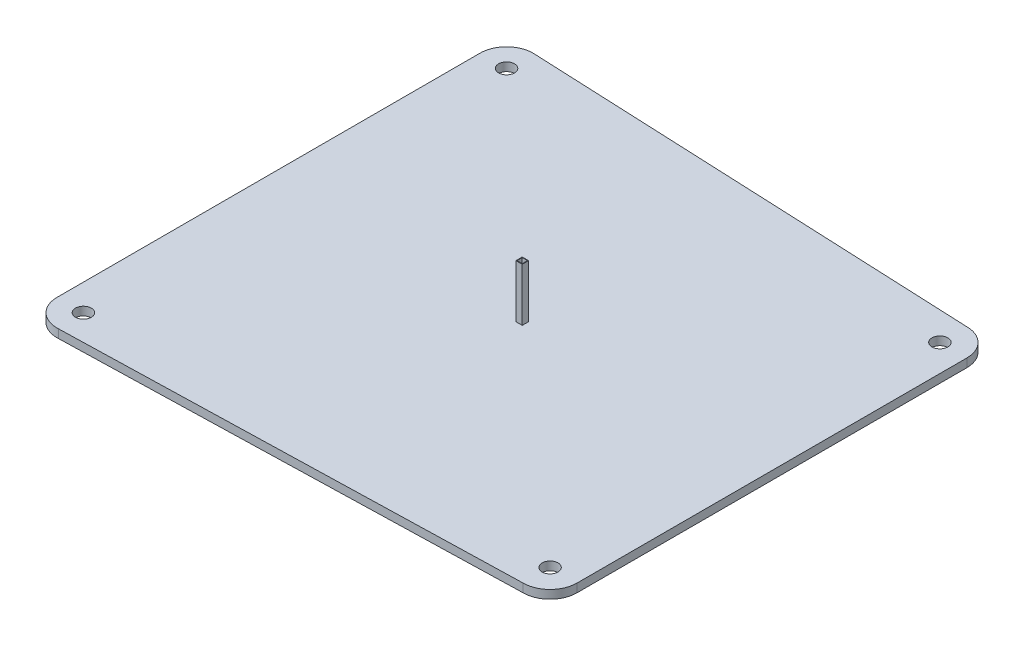
ISO-10303-21;
HEADER;
FILE_DESCRIPTION(('STEP AP214'),'2;1');
FILE_NAME('part.step','',(''),(''),'','','');
FILE_SCHEMA(('AUTOMOTIVE_DESIGN { 1 0 10303 214 1 1 1 1 }'));
ENDSEC;
DATA;
#1=APPLICATION_CONTEXT('core data for automotive mechanical design processes');
#2=APPLICATION_PROTOCOL_DEFINITION('international standard','automotive_design',2000,#1);
#3=PRODUCT_CONTEXT('',#1,'mechanical');
#4=PRODUCT('Part','Part','',(#3));
#5=PRODUCT_RELATED_PRODUCT_CATEGORY('part','',(#4));
#6=PRODUCT_DEFINITION_FORMATION('','',#4);
#7=PRODUCT_DEFINITION_CONTEXT('part definition',#1,'design');
#8=PRODUCT_DEFINITION('design','',#6,#7);
#9=PRODUCT_DEFINITION_SHAPE('','',#8);
#10=(LENGTH_UNIT() NAMED_UNIT(*) SI_UNIT(.MILLI.,.METRE.));
#11=(NAMED_UNIT(*) PLANE_ANGLE_UNIT() SI_UNIT($,.RADIAN.));
#12=(NAMED_UNIT(*) SI_UNIT($,.STERADIAN.) SOLID_ANGLE_UNIT());
#13=UNCERTAINTY_MEASURE_WITH_UNIT(LENGTH_MEASURE(1.E-05),#10,'distance_accuracy_value','');
#14=(GEOMETRIC_REPRESENTATION_CONTEXT(3) GLOBAL_UNCERTAINTY_ASSIGNED_CONTEXT((#13)) GLOBAL_UNIT_ASSIGNED_CONTEXT((#10,
#11,#12)) REPRESENTATION_CONTEXT('',''));
#15=CARTESIAN_POINT('',(0.,0.,0.));
#16=DIRECTION('',(0.,0.,1.));
#17=DIRECTION('',(1.,0.,0.));
#18=AXIS2_PLACEMENT_3D('',#15,#16,#17);
#19=CARTESIAN_POINT('',(0.,1.6,0.));
#20=DIRECTION('',(0.,-1.,0.));
#21=DIRECTION('',(0.,0.,-1.));
#22=AXIS2_PLACEMENT_3D('',#19,#20,#21);
#23=PLANE('',#22);
#24=CARTESIAN_POINT('',(-42.945,1.6,-39.985));
#25=DIRECTION('',(0.,1.,0.));
#26=DIRECTION('',(0.,0.,1.));
#27=AXIS2_PLACEMENT_3D('',#24,#25,#26);
#28=CIRCLE('',#27,1.5);
#29=CARTESIAN_POINT('',(-42.945,1.6,-38.485));
#30=VERTEX_POINT('',#29);
#31=EDGE_CURVE('E201',#30,#30,#28,.T.);
#32=ORIENTED_EDGE('',*,*,#31,.F.);
#33=EDGE_LOOP('',(#32));
#34=FACE_BOUND('',#33,.T.);
#35=CARTESIAN_POINT('',(-42.945,1.6,39.985));
#36=DIRECTION('',(0.,1.,0.));
#37=DIRECTION('',(0.,0.,1.));
#38=AXIS2_PLACEMENT_3D('',#35,#36,#37);
#39=CIRCLE('',#38,1.5);
#40=CARTESIAN_POINT('',(-42.945,1.6,41.485));
#41=VERTEX_POINT('',#40);
#42=EDGE_CURVE('E198',#41,#41,#39,.T.);
#43=ORIENTED_EDGE('',*,*,#42,.F.);
#44=EDGE_LOOP('',(#43));
#45=FACE_BOUND('',#44,.T.);
#46=CARTESIAN_POINT('',(42.845,1.6,37.585));
#47=DIRECTION('',(0.,1.,0.));
#48=DIRECTION('',(0.,0.,1.));
#49=AXIS2_PLACEMENT_3D('',#46,#47,#48);
#50=CIRCLE('',#49,1.5);
#51=CARTESIAN_POINT('',(42.845,1.6,39.085));
#52=VERTEX_POINT('',#51);
#53=EDGE_CURVE('E194',#52,#52,#50,.T.);
#54=ORIENTED_EDGE('',*,*,#53,.F.);
#55=EDGE_LOOP('',(#54));
#56=FACE_BOUND('',#55,.T.);
#57=CARTESIAN_POINT('',(42.845,1.6,-36.085));
#58=DIRECTION('',(0.,1.,0.));
#59=DIRECTION('',(0.,0.,1.));
#60=AXIS2_PLACEMENT_3D('',#57,#58,#59);
#61=CIRCLE('',#60,1.5);
#62=CARTESIAN_POINT('',(42.845,1.6,-34.585));
#63=VERTEX_POINT('',#62);
#64=EDGE_CURVE('E190',#63,#63,#61,.T.);
#65=ORIENTED_EDGE('',*,*,#64,.F.);
#66=EDGE_LOOP('',(#65));
#67=FACE_BOUND('',#66,.T.);
#68=DIRECTION('',(0.,0.,-1.));
#69=VECTOR('',#68,1.);
#70=CARTESIAN_POINT('',(0.600000000000001,1.6,0.6));
#71=LINE('',#70,#69);
#72=CARTESIAN_POINT('',(0.600000000000001,1.6,0.6));
#73=VERTEX_POINT('',#72);
#74=CARTESIAN_POINT('',(0.600000000000001,1.6,-0.6));
#75=VERTEX_POINT('',#74);
#76=EDGE_CURVE('E265',#73,#75,#71,.T.);
#77=ORIENTED_EDGE('',*,*,#76,.F.);
#78=DIRECTION('',(1.,0.,0.));
#79=VECTOR('',#78,1.);
#80=CARTESIAN_POINT('',(-0.599999999999999,1.6,0.6));
#81=LINE('',#80,#79);
#82=CARTESIAN_POINT('',(-0.599999999999999,1.6,0.6));
#83=VERTEX_POINT('',#82);
#84=EDGE_CURVE('E270',#83,#73,#81,.T.);
#85=ORIENTED_EDGE('',*,*,#84,.F.);
#86=DIRECTION('',(0.,0.,1.));
#87=VECTOR('',#86,1.);
#88=CARTESIAN_POINT('',(-0.599999999999999,1.6,0.6));
#89=LINE('',#88,#87);
#90=CARTESIAN_POINT('',(-0.599999999999999,1.6,-0.6));
#91=VERTEX_POINT('',#90);
#92=EDGE_CURVE('E282',#91,#83,#89,.T.);
#93=ORIENTED_EDGE('',*,*,#92,.F.);
#94=DIRECTION('',(-1.,0.,0.));
#95=VECTOR('',#94,1.);
#96=CARTESIAN_POINT('',(-0.599999999999999,1.6,-0.6));
#97=LINE('',#96,#95);
#98=EDGE_CURVE('E279',#75,#91,#97,.T.);
#99=ORIENTED_EDGE('',*,*,#98,.F.);
#100=EDGE_LOOP('',(#77,#85,#93,#99));
#101=FACE_BOUND('',#100,.T.);
#102=CARTESIAN_POINT('',(-42.945,1.6,-39.985));
#103=DIRECTION('',(0.,1.,0.));
#104=DIRECTION('',(0.,0.,1.));
#105=AXIS2_PLACEMENT_3D('',#102,#103,#104);
#106=CIRCLE('',#105,5.00000000000002);
#107=CARTESIAN_POINT('',(-42.5029252724991,1.6,-44.9654186506061));
#108=VERTEX_POINT('',#107);
#109=CARTESIAN_POINT('',(-47.945,1.6,-39.985));
#110=VERTEX_POINT('',#109);
#111=EDGE_CURVE('E159',#108,#110,#106,.T.);
#112=ORIENTED_EDGE('',*,*,#111,.T.);
#113=DIRECTION('',(0.,0.,1.));
#114=VECTOR('',#113,1.);
#115=CARTESIAN_POINT('',(-47.945,1.6,45.085));
#116=LINE('',#115,#114);
#117=CARTESIAN_POINT('',(-47.945,1.6,39.985));
#118=VERTEX_POINT('',#117);
#119=EDGE_CURVE('E166',#110,#118,#116,.T.);
#120=ORIENTED_EDGE('',*,*,#119,.T.);
#121=CARTESIAN_POINT('',(-42.945,1.6,39.985));
#122=DIRECTION('',(0.,1.,0.));
#123=DIRECTION('',(0.,0.,1.));
#124=AXIS2_PLACEMENT_3D('',#121,#122,#123);
#125=CIRCLE('',#124,5.);
#126=CARTESIAN_POINT('',(-42.6770960432094,1.6,44.9778175882898));
#127=VERTEX_POINT('',#126);
#128=EDGE_CURVE('E150',#118,#127,#125,.T.);
#129=ORIENTED_EDGE('',*,*,#128,.T.);
#130=DIRECTION('',(0.999640814907525,0.,-0.0268000218473834));
#131=VECTOR('',#130,1.);
#132=CARTESIAN_POINT('',(-42.6770960432094,1.6,44.9778175882898));
#133=LINE('',#132,#131);
#134=CARTESIAN_POINT('',(42.845,1.6,42.6850000000003));
#135=VERTEX_POINT('',#134);
#136=EDGE_CURVE('E158',#127,#135,#133,.T.);
#137=ORIENTED_EDGE('',*,*,#136,.T.);
#138=CARTESIAN_POINT('',(42.845,1.6,37.585));
#139=DIRECTION('',(0.,1.,0.));
#140=DIRECTION('',(0.,0.,1.));
#141=AXIS2_PLACEMENT_3D('',#138,#139,#140);
#142=CIRCLE('',#141,5.10000000000028);
#143=CARTESIAN_POINT('',(47.9450000000003,1.6,37.585));
#144=VERTEX_POINT('',#143);
#145=EDGE_CURVE('E375',#135,#144,#142,.T.);
#146=ORIENTED_EDGE('',*,*,#145,.T.);
#147=DIRECTION('',(0.,0.,-1.));
#148=VECTOR('',#147,1.);
#149=CARTESIAN_POINT('',(47.945,1.6,45.085));
#150=LINE('',#149,#148);
#151=CARTESIAN_POINT('',(47.9450000000002,1.6,-36.085));
#152=VERTEX_POINT('',#151);
#153=EDGE_CURVE('E175',#144,#152,#150,.T.);
#154=ORIENTED_EDGE('',*,*,#153,.T.);
#155=CARTESIAN_POINT('',(42.845,1.6,-36.085));
#156=DIRECTION('',(0.,1.,0.));
#157=DIRECTION('',(0.,0.,1.));
#158=AXIS2_PLACEMENT_3D('',#155,#156,#157);
#159=CIRCLE('',#158,5.10000000000022);
#160=CARTESIAN_POINT('',(42.845,1.6,-41.1850000000002));
#161=VERTEX_POINT('',#160);
#162=EDGE_CURVE('E379',#152,#161,#159,.T.);
#163=ORIENTED_EDGE('',*,*,#162,.T.);
#164=DIRECTION('',(-0.999020452773921,0.,-0.0442508185166185));
#165=VECTOR('',#164,1.);
#166=CARTESIAN_POINT('',(-42.5029252724991,1.6,-44.9654186506061));
#167=LINE('',#166,#165);
#168=EDGE_CURVE('E229',#161,#108,#167,.T.);
#169=ORIENTED_EDGE('',*,*,#168,.T.);
#170=EDGE_LOOP('',(#112,#120,#129,#137,#146,#154,#163,#169));
#171=FACE_BOUND('',#170,.T.);
#172=ADVANCED_FACE('F39',(#34,#45,#56,#67,#101,#171),#23,.F.);
#173=CARTESIAN_POINT('',(47.945,1.6,45.085));
#174=DIRECTION('',(-1.,0.,0.));
#175=DIRECTION('',(0.,0.,1.));
#176=AXIS2_PLACEMENT_3D('',#173,#174,#175);
#177=PLANE('',#176);
#178=DIRECTION('',(0.,0.,-1.));
#179=VECTOR('',#178,1.);
#180=CARTESIAN_POINT('',(47.945,0.,45.085));
#181=LINE('',#180,#179);
#182=CARTESIAN_POINT('',(47.9450000000003,0.,37.585));
#183=VERTEX_POINT('',#182);
#184=CARTESIAN_POINT('',(47.945,0.,-36.085));
#185=VERTEX_POINT('',#184);
#186=EDGE_CURVE('E183',#183,#185,#181,.T.);
#187=ORIENTED_EDGE('',*,*,#186,.T.);
#188=DIRECTION('',(0.,1.,0.));
#189=VECTOR('',#188,1.);
#190=CARTESIAN_POINT('',(47.9450000000002,-8.4,-36.085));
#191=LINE('',#190,#189);
#192=EDGE_CURVE('E62',#185,#152,#191,.T.);
#193=ORIENTED_EDGE('',*,*,#192,.T.);
#194=ORIENTED_EDGE('',*,*,#153,.F.);
#195=DIRECTION('',(0.,1.,0.));
#196=VECTOR('',#195,1.);
#197=CARTESIAN_POINT('',(47.9450000000003,-8.4,37.585));
#198=LINE('',#197,#196);
#199=EDGE_CURVE('E233',#183,#144,#198,.T.);
#200=ORIENTED_EDGE('',*,*,#199,.F.);
#201=EDGE_LOOP('',(#187,#193,#194,#200));
#202=FACE_BOUND('',#201,.T.);
#203=ADVANCED_FACE('F41',(#202),#177,.F.);
#204=CARTESIAN_POINT('',(-47.945,1.6,45.085));
#205=DIRECTION('',(1.,0.,0.));
#206=DIRECTION('',(0.,0.,-1.));
#207=AXIS2_PLACEMENT_3D('',#204,#205,#206);
#208=PLANE('',#207);
#209=DIRECTION('',(0.,1.,0.));
#210=VECTOR('',#209,1.);
#211=CARTESIAN_POINT('',(-47.945,-8.4,-39.985));
#212=LINE('',#211,#210);
#213=CARTESIAN_POINT('',(-47.945,0.,-39.985));
#214=VERTEX_POINT('',#213);
#215=EDGE_CURVE('E169',#214,#110,#212,.T.);
#216=ORIENTED_EDGE('',*,*,#215,.F.);
#217=DIRECTION('',(0.,0.,1.));
#218=VECTOR('',#217,1.);
#219=CARTESIAN_POINT('',(-47.945,0.,45.085));
#220=LINE('',#219,#218);
#221=CARTESIAN_POINT('',(-47.945,0.,39.985));
#222=VERTEX_POINT('',#221);
#223=EDGE_CURVE('E168',#214,#222,#220,.T.);
#224=ORIENTED_EDGE('',*,*,#223,.T.);
#225=DIRECTION('',(0.,1.,0.));
#226=VECTOR('',#225,1.);
#227=CARTESIAN_POINT('',(-47.945,-8.4,39.985));
#228=LINE('',#227,#226);
#229=EDGE_CURVE('E54',#222,#118,#228,.T.);
#230=ORIENTED_EDGE('',*,*,#229,.T.);
#231=ORIENTED_EDGE('',*,*,#119,.F.);
#232=EDGE_LOOP('',(#216,#224,#230,#231));
#233=FACE_BOUND('',#232,.T.);
#234=ADVANCED_FACE('F165',(#233),#208,.F.);
#235=CARTESIAN_POINT('',(0.,0.,0.));
#236=DIRECTION('',(0.,-1.,0.));
#237=DIRECTION('',(0.,0.,-1.));
#238=AXIS2_PLACEMENT_3D('',#235,#236,#237);
#239=PLANE('',#238);
#240=CARTESIAN_POINT('',(-42.945,0.,-39.985));
#241=DIRECTION('',(0.,-1.,0.));
#242=DIRECTION('',(0.,0.,-1.));
#243=AXIS2_PLACEMENT_3D('',#240,#241,#242);
#244=CIRCLE('',#243,1.5);
#245=CARTESIAN_POINT('',(-42.945,0.,-41.485));
#246=VERTEX_POINT('',#245);
#247=EDGE_CURVE('E199',#246,#246,#244,.T.);
#248=ORIENTED_EDGE('',*,*,#247,.F.);
#249=EDGE_LOOP('',(#248));
#250=FACE_BOUND('',#249,.T.);
#251=CARTESIAN_POINT('',(-42.945,0.,39.985));
#252=DIRECTION('',(0.,-1.,0.));
#253=DIRECTION('',(0.,0.,-1.));
#254=AXIS2_PLACEMENT_3D('',#251,#252,#253);
#255=CIRCLE('',#254,1.5);
#256=CARTESIAN_POINT('',(-42.945,0.,38.485));
#257=VERTEX_POINT('',#256);
#258=EDGE_CURVE('E195',#257,#257,#255,.T.);
#259=ORIENTED_EDGE('',*,*,#258,.F.);
#260=EDGE_LOOP('',(#259));
#261=FACE_BOUND('',#260,.T.);
#262=CARTESIAN_POINT('',(42.845,0.,37.585));
#263=DIRECTION('',(0.,-1.,0.));
#264=DIRECTION('',(0.,0.,-1.));
#265=AXIS2_PLACEMENT_3D('',#262,#263,#264);
#266=CIRCLE('',#265,1.5);
#267=CARTESIAN_POINT('',(42.845,0.,36.085));
#268=VERTEX_POINT('',#267);
#269=EDGE_CURVE('E191',#268,#268,#266,.T.);
#270=ORIENTED_EDGE('',*,*,#269,.F.);
#271=EDGE_LOOP('',(#270));
#272=FACE_BOUND('',#271,.T.);
#273=CARTESIAN_POINT('',(42.845,0.,-36.085));
#274=DIRECTION('',(0.,-1.,0.));
#275=DIRECTION('',(0.,0.,-1.));
#276=AXIS2_PLACEMENT_3D('',#273,#274,#275);
#277=CIRCLE('',#276,1.5);
#278=CARTESIAN_POINT('',(42.845,0.,-37.585));
#279=VERTEX_POINT('',#278);
#280=EDGE_CURVE('E186',#279,#279,#277,.T.);
#281=ORIENTED_EDGE('',*,*,#280,.F.);
#282=EDGE_LOOP('',(#281));
#283=FACE_BOUND('',#282,.T.);
#284=ORIENTED_EDGE('',*,*,#223,.F.);
#285=CARTESIAN_POINT('',(-42.945,0.,-39.985));
#286=DIRECTION('',(0.,-1.,0.));
#287=DIRECTION('',(0.,0.,-1.));
#288=AXIS2_PLACEMENT_3D('',#285,#286,#287);
#289=CIRCLE('',#288,5.00000000000002);
#290=CARTESIAN_POINT('',(-42.5029252724991,0.,-44.9654186506061));
#291=VERTEX_POINT('',#290);
#292=EDGE_CURVE('E12',#214,#291,#289,.T.);
#293=ORIENTED_EDGE('',*,*,#292,.T.);
#294=DIRECTION('',(0.999020452773921,0.,0.0442508185166185));
#295=VECTOR('',#294,1.);
#296=CARTESIAN_POINT('',(1.90458105669061,0.,-42.998423382499));
#297=LINE('',#296,#295);
#298=CARTESIAN_POINT('',(42.845,0.,-41.1850000000002));
#299=VERTEX_POINT('',#298);
#300=EDGE_CURVE('E47',#291,#299,#297,.T.);
#301=ORIENTED_EDGE('',*,*,#300,.T.);
#302=CARTESIAN_POINT('',(42.845,0.,-36.085));
#303=DIRECTION('',(0.,-1.,0.));
#304=DIRECTION('',(0.,0.,-1.));
#305=AXIS2_PLACEMENT_3D('',#302,#303,#304);
#306=CIRCLE('',#305,5.10000000000022);
#307=EDGE_CURVE('E208',#299,#185,#306,.T.);
#308=ORIENTED_EDGE('',*,*,#307,.T.);
#309=ORIENTED_EDGE('',*,*,#186,.F.);
#310=CARTESIAN_POINT('',(42.845,0.,37.585));
#311=DIRECTION('',(0.,-1.,0.));
#312=DIRECTION('',(0.,0.,-1.));
#313=AXIS2_PLACEMENT_3D('',#310,#311,#312);
#314=CIRCLE('',#313,5.10000000000028);
#315=CARTESIAN_POINT('',(42.845,0.,42.6850000000003));
#316=VERTEX_POINT('',#315);
#317=EDGE_CURVE('E205',#183,#316,#314,.T.);
#318=ORIENTED_EDGE('',*,*,#317,.T.);
#319=DIRECTION('',(-0.999640814907525,0.,0.0268000218473834));
#320=VECTOR('',#319,1.);
#321=CARTESIAN_POINT('',(1.17432108253295,0.,43.8021763784845));
#322=LINE('',#321,#320);
#323=CARTESIAN_POINT('',(-42.6770960432094,0.,44.9778175882898));
#324=VERTEX_POINT('',#323);
#325=EDGE_CURVE('E177',#316,#324,#322,.T.);
#326=ORIENTED_EDGE('',*,*,#325,.T.);
#327=CARTESIAN_POINT('',(-42.945,0.,39.985));
#328=DIRECTION('',(0.,-1.,0.));
#329=DIRECTION('',(0.,0.,-1.));
#330=AXIS2_PLACEMENT_3D('',#327,#328,#329);
#331=CIRCLE('',#330,5.);
#332=EDGE_CURVE('E174',#324,#222,#331,.T.);
#333=ORIENTED_EDGE('',*,*,#332,.T.);
#334=EDGE_LOOP('',(#284,#293,#301,#308,#309,#318,#326,#333));
#335=FACE_BOUND('',#334,.T.);
#336=ADVANCED_FACE('F211',(#250,#261,#272,#283,#335),#239,.T.);
#337=CARTESIAN_POINT('',(42.845,-8.4,-36.085));
#338=DIRECTION('',(0.,1.,0.));
#339=DIRECTION('',(0.,0.,1.));
#340=AXIS2_PLACEMENT_3D('',#337,#338,#339);
#341=CYLINDRICAL_SURFACE('',#340,1.5);
#342=ORIENTED_EDGE('',*,*,#280,.T.);
#343=EDGE_LOOP('',(#342));
#344=FACE_BOUND('',#343,.T.);
#345=ORIENTED_EDGE('',*,*,#64,.T.);
#346=EDGE_LOOP('',(#345));
#347=FACE_BOUND('',#346,.T.);
#348=ADVANCED_FACE('F306',(#344,#347),#341,.F.);
#349=CARTESIAN_POINT('',(42.845,-8.4,37.585));
#350=DIRECTION('',(0.,1.,0.));
#351=DIRECTION('',(0.,0.,1.));
#352=AXIS2_PLACEMENT_3D('',#349,#350,#351);
#353=CYLINDRICAL_SURFACE('',#352,1.5);
#354=ORIENTED_EDGE('',*,*,#269,.T.);
#355=EDGE_LOOP('',(#354));
#356=FACE_BOUND('',#355,.T.);
#357=ORIENTED_EDGE('',*,*,#53,.T.);
#358=EDGE_LOOP('',(#357));
#359=FACE_BOUND('',#358,.T.);
#360=ADVANCED_FACE('F348',(#356,#359),#353,.F.);
#361=CARTESIAN_POINT('',(-42.945,-8.4,39.985));
#362=DIRECTION('',(0.,1.,0.));
#363=DIRECTION('',(0.,0.,1.));
#364=AXIS2_PLACEMENT_3D('',#361,#362,#363);
#365=CYLINDRICAL_SURFACE('',#364,1.5);
#366=ORIENTED_EDGE('',*,*,#258,.T.);
#367=EDGE_LOOP('',(#366));
#368=FACE_BOUND('',#367,.T.);
#369=ORIENTED_EDGE('',*,*,#42,.T.);
#370=EDGE_LOOP('',(#369));
#371=FACE_BOUND('',#370,.T.);
#372=ADVANCED_FACE('F344',(#368,#371),#365,.F.);
#373=CARTESIAN_POINT('',(-42.945,-8.4,-39.985));
#374=DIRECTION('',(0.,1.,0.));
#375=DIRECTION('',(0.,0.,1.));
#376=AXIS2_PLACEMENT_3D('',#373,#374,#375);
#377=CYLINDRICAL_SURFACE('',#376,1.5);
#378=ORIENTED_EDGE('',*,*,#247,.T.);
#379=EDGE_LOOP('',(#378));
#380=FACE_BOUND('',#379,.T.);
#381=ORIENTED_EDGE('',*,*,#31,.T.);
#382=EDGE_LOOP('',(#381));
#383=FACE_BOUND('',#382,.T.);
#384=ADVANCED_FACE('F341',(#380,#383),#377,.F.);
#385=CARTESIAN_POINT('',(0.,11.6,0.));
#386=DIRECTION('',(0.,-1.,0.));
#387=DIRECTION('',(0.,0.,-1.));
#388=AXIS2_PLACEMENT_3D('',#385,#386,#387);
#389=PLANE('',#388);
#390=DIRECTION('',(0.,0.,-1.));
#391=VECTOR('',#390,1.);
#392=CARTESIAN_POINT('',(0.600000000000001,11.6,0.6));
#393=LINE('',#392,#391);
#394=CARTESIAN_POINT('',(0.600000000000001,11.6,0.6));
#395=VERTEX_POINT('',#394);
#396=CARTESIAN_POINT('',(0.600000000000001,11.6,-0.6));
#397=VERTEX_POINT('',#396);
#398=EDGE_CURVE('E266',#395,#397,#393,.T.);
#399=ORIENTED_EDGE('',*,*,#398,.T.);
#400=DIRECTION('',(-1.,0.,0.));
#401=VECTOR('',#400,1.);
#402=CARTESIAN_POINT('',(-0.599999999999999,11.6,-0.6));
#403=LINE('',#402,#401);
#404=CARTESIAN_POINT('',(-0.599999999999999,11.6,-0.6));
#405=VERTEX_POINT('',#404);
#406=EDGE_CURVE('E269',#397,#405,#403,.T.);
#407=ORIENTED_EDGE('',*,*,#406,.T.);
#408=DIRECTION('',(0.,0.,1.));
#409=VECTOR('',#408,1.);
#410=CARTESIAN_POINT('',(-0.599999999999999,11.6,0.6));
#411=LINE('',#410,#409);
#412=CARTESIAN_POINT('',(-0.599999999999999,11.6,0.6));
#413=VERTEX_POINT('',#412);
#414=EDGE_CURVE('E272',#405,#413,#411,.T.);
#415=ORIENTED_EDGE('',*,*,#414,.T.);
#416=DIRECTION('',(1.,0.,0.));
#417=VECTOR('',#416,1.);
#418=CARTESIAN_POINT('',(-0.599999999999999,11.6,0.6));
#419=LINE('',#418,#417);
#420=EDGE_CURVE('E274',#413,#395,#419,.T.);
#421=ORIENTED_EDGE('',*,*,#420,.T.);
#422=EDGE_LOOP('',(#399,#407,#415,#421));
#423=FACE_BOUND('',#422,.T.);
#424=DIRECTION('',(0.,0.,-1.));
#425=VECTOR('',#424,1.);
#426=CARTESIAN_POINT('',(0.5,11.6,0.5));
#427=LINE('',#426,#425);
#428=CARTESIAN_POINT('',(0.5,11.6,0.5));
#429=VERTEX_POINT('',#428);
#430=CARTESIAN_POINT('',(0.5,11.6,-0.5));
#431=VERTEX_POINT('',#430);
#432=EDGE_CURVE('E239',#429,#431,#427,.T.);
#433=ORIENTED_EDGE('',*,*,#432,.F.);
#434=DIRECTION('',(1.,0.,0.));
#435=VECTOR('',#434,1.);
#436=CARTESIAN_POINT('',(-0.5,11.6,0.5));
#437=LINE('',#436,#435);
#438=CARTESIAN_POINT('',(-0.5,11.6,0.5));
#439=VERTEX_POINT('',#438);
#440=EDGE_CURVE('E247',#439,#429,#437,.T.);
#441=ORIENTED_EDGE('',*,*,#440,.F.);
#442=DIRECTION('',(0.,0.,1.));
#443=VECTOR('',#442,1.);
#444=CARTESIAN_POINT('',(-0.5,11.6,0.5));
#445=LINE('',#444,#443);
#446=CARTESIAN_POINT('',(-0.5,11.6,-0.5));
#447=VERTEX_POINT('',#446);
#448=EDGE_CURVE('E244',#447,#439,#445,.T.);
#449=ORIENTED_EDGE('',*,*,#448,.F.);
#450=DIRECTION('',(-1.,0.,0.));
#451=VECTOR('',#450,1.);
#452=CARTESIAN_POINT('',(-0.5,11.6,-0.5));
#453=LINE('',#452,#451);
#454=EDGE_CURVE('E241',#431,#447,#453,.T.);
#455=ORIENTED_EDGE('',*,*,#454,.F.);
#456=EDGE_LOOP('',(#433,#441,#449,#455));
#457=FACE_BOUND('',#456,.T.);
#458=ADVANCED_FACE('F323',(#423,#457),#389,.F.);
#459=CARTESIAN_POINT('',(0.600000000000001,11.6,0.6));
#460=DIRECTION('',(-1.,0.,0.));
#461=DIRECTION('',(0.,0.,1.));
#462=AXIS2_PLACEMENT_3D('',#459,#460,#461);
#463=PLANE('',#462);
#464=ORIENTED_EDGE('',*,*,#76,.T.);
#465=DIRECTION('',(0.,-1.,0.));
#466=VECTOR('',#465,1.);
#467=CARTESIAN_POINT('',(0.600000000000001,11.6,-0.6));
#468=LINE('',#467,#466);
#469=EDGE_CURVE('E295',#397,#75,#468,.T.);
#470=ORIENTED_EDGE('',*,*,#469,.F.);
#471=ORIENTED_EDGE('',*,*,#398,.F.);
#472=DIRECTION('',(0.,-1.,0.));
#473=VECTOR('',#472,1.);
#474=CARTESIAN_POINT('',(0.600000000000001,11.6,0.6));
#475=LINE('',#474,#473);
#476=EDGE_CURVE('E276',#395,#73,#475,.T.);
#477=ORIENTED_EDGE('',*,*,#476,.T.);
#478=EDGE_LOOP('',(#464,#470,#471,#477));
#479=FACE_BOUND('',#478,.T.);
#480=ADVANCED_FACE('F321',(#479),#463,.F.);
#481=CARTESIAN_POINT('',(-0.599999999999999,11.6,-0.6));
#482=DIRECTION('',(0.,0.,1.));
#483=DIRECTION('',(1.,0.,0.));
#484=AXIS2_PLACEMENT_3D('',#481,#482,#483);
#485=PLANE('',#484);
#486=ORIENTED_EDGE('',*,*,#98,.T.);
#487=DIRECTION('',(0.,-1.,0.));
#488=VECTOR('',#487,1.);
#489=CARTESIAN_POINT('',(-0.599999999999999,11.6,-0.6));
#490=LINE('',#489,#488);
#491=EDGE_CURVE('E292',#405,#91,#490,.T.);
#492=ORIENTED_EDGE('',*,*,#491,.F.);
#493=ORIENTED_EDGE('',*,*,#406,.F.);
#494=ORIENTED_EDGE('',*,*,#469,.T.);
#495=EDGE_LOOP('',(#486,#492,#493,#494));
#496=FACE_BOUND('',#495,.T.);
#497=ADVANCED_FACE('F330',(#496),#485,.F.);
#498=CARTESIAN_POINT('',(-0.599999999999999,11.6,0.6));
#499=DIRECTION('',(1.,0.,0.));
#500=DIRECTION('',(0.,0.,-1.));
#501=AXIS2_PLACEMENT_3D('',#498,#499,#500);
#502=PLANE('',#501);
#503=ORIENTED_EDGE('',*,*,#92,.T.);
#504=DIRECTION('',(0.,-1.,0.));
#505=VECTOR('',#504,1.);
#506=CARTESIAN_POINT('',(-0.599999999999999,11.6,0.6));
#507=LINE('',#506,#505);
#508=EDGE_CURVE('E289',#413,#83,#507,.T.);
#509=ORIENTED_EDGE('',*,*,#508,.F.);
#510=ORIENTED_EDGE('',*,*,#414,.F.);
#511=ORIENTED_EDGE('',*,*,#491,.T.);
#512=EDGE_LOOP('',(#503,#509,#510,#511));
#513=FACE_BOUND('',#512,.T.);
#514=ADVANCED_FACE('F328',(#513),#502,.F.);
#515=CARTESIAN_POINT('',(-0.599999999999999,11.6,0.6));
#516=DIRECTION('',(0.,0.,-1.));
#517=DIRECTION('',(-1.,0.,0.));
#518=AXIS2_PLACEMENT_3D('',#515,#516,#517);
#519=PLANE('',#518);
#520=ORIENTED_EDGE('',*,*,#84,.T.);
#521=ORIENTED_EDGE('',*,*,#476,.F.);
#522=ORIENTED_EDGE('',*,*,#420,.F.);
#523=ORIENTED_EDGE('',*,*,#508,.T.);
#524=EDGE_LOOP('',(#520,#521,#522,#523));
#525=FACE_BOUND('',#524,.T.);
#526=ADVANCED_FACE('F317',(#525),#519,.F.);
#527=CARTESIAN_POINT('',(0.5,11.6,0.5));
#528=DIRECTION('',(-1.,0.,0.));
#529=DIRECTION('',(0.,0.,1.));
#530=AXIS2_PLACEMENT_3D('',#527,#528,#529);
#531=PLANE('',#530);
#532=DIRECTION('',(0.,0.,-1.));
#533=VECTOR('',#532,1.);
#534=CARTESIAN_POINT('',(0.5,1.6,0.5));
#535=LINE('',#534,#533);
#536=CARTESIAN_POINT('',(0.5,1.6,0.5));
#537=VERTEX_POINT('',#536);
#538=CARTESIAN_POINT('',(0.5,1.6,-0.5));
#539=VERTEX_POINT('',#538);
#540=EDGE_CURVE('E222',#537,#539,#535,.T.);
#541=ORIENTED_EDGE('',*,*,#540,.F.);
#542=DIRECTION('',(0.,-1.,0.));
#543=VECTOR('',#542,1.);
#544=CARTESIAN_POINT('',(0.5,11.6,0.5));
#545=LINE('',#544,#543);
#546=EDGE_CURVE('E248',#429,#537,#545,.T.);
#547=ORIENTED_EDGE('',*,*,#546,.F.);
#548=ORIENTED_EDGE('',*,*,#432,.T.);
#549=DIRECTION('',(0.,-1.,0.));
#550=VECTOR('',#549,1.);
#551=CARTESIAN_POINT('',(0.5,11.6,-0.5));
#552=LINE('',#551,#550);
#553=EDGE_CURVE('E262',#431,#539,#552,.T.);
#554=ORIENTED_EDGE('',*,*,#553,.T.);
#555=EDGE_LOOP('',(#541,#547,#548,#554));
#556=FACE_BOUND('',#555,.T.);
#557=ADVANCED_FACE('F409',(#556),#531,.T.);
#558=CARTESIAN_POINT('',(-0.5,11.6,-0.5));
#559=DIRECTION('',(0.,0.,1.));
#560=DIRECTION('',(1.,0.,0.));
#561=AXIS2_PLACEMENT_3D('',#558,#559,#560);
#562=PLANE('',#561);
#563=DIRECTION('',(-1.,0.,0.));
#564=VECTOR('',#563,1.);
#565=CARTESIAN_POINT('',(-0.5,1.6,-0.5));
#566=LINE('',#565,#564);
#567=CARTESIAN_POINT('',(-0.5,1.6,-0.5));
#568=VERTEX_POINT('',#567);
#569=EDGE_CURVE('E225',#539,#568,#566,.T.);
#570=ORIENTED_EDGE('',*,*,#569,.F.);
#571=ORIENTED_EDGE('',*,*,#553,.F.);
#572=ORIENTED_EDGE('',*,*,#454,.T.);
#573=DIRECTION('',(0.,-1.,0.));
#574=VECTOR('',#573,1.);
#575=CARTESIAN_POINT('',(-0.5,11.6,-0.5));
#576=LINE('',#575,#574);
#577=EDGE_CURVE('E260',#447,#568,#576,.T.);
#578=ORIENTED_EDGE('',*,*,#577,.T.);
#579=EDGE_LOOP('',(#570,#571,#572,#578));
#580=FACE_BOUND('',#579,.T.);
#581=ADVANCED_FACE('F405',(#580),#562,.T.);
#582=CARTESIAN_POINT('',(-0.5,11.6,0.5));
#583=DIRECTION('',(1.,0.,0.));
#584=DIRECTION('',(0.,0.,-1.));
#585=AXIS2_PLACEMENT_3D('',#582,#583,#584);
#586=PLANE('',#585);
#587=DIRECTION('',(0.,0.,1.));
#588=VECTOR('',#587,1.);
#589=CARTESIAN_POINT('',(-0.5,1.6,0.5));
#590=LINE('',#589,#588);
#591=CARTESIAN_POINT('',(-0.5,1.6,0.5));
#592=VERTEX_POINT('',#591);
#593=EDGE_CURVE('E252',#568,#592,#590,.T.);
#594=ORIENTED_EDGE('',*,*,#593,.F.);
#595=ORIENTED_EDGE('',*,*,#577,.F.);
#596=ORIENTED_EDGE('',*,*,#448,.T.);
#597=DIRECTION('',(0.,-1.,0.));
#598=VECTOR('',#597,1.);
#599=CARTESIAN_POINT('',(-0.5,11.6,0.5));
#600=LINE('',#599,#598);
#601=EDGE_CURVE('E258',#439,#592,#600,.T.);
#602=ORIENTED_EDGE('',*,*,#601,.T.);
#603=EDGE_LOOP('',(#594,#595,#596,#602));
#604=FACE_BOUND('',#603,.T.);
#605=ADVANCED_FACE('F401',(#604),#586,.T.);
#606=CARTESIAN_POINT('',(-0.5,11.6,0.5));
#607=DIRECTION('',(0.,0.,-1.));
#608=DIRECTION('',(-1.,0.,0.));
#609=AXIS2_PLACEMENT_3D('',#606,#607,#608);
#610=PLANE('',#609);
#611=DIRECTION('',(1.,0.,0.));
#612=VECTOR('',#611,1.);
#613=CARTESIAN_POINT('',(-0.5,1.6,0.5));
#614=LINE('',#613,#612);
#615=EDGE_CURVE('E242',#592,#537,#614,.T.);
#616=ORIENTED_EDGE('',*,*,#615,.F.);
#617=ORIENTED_EDGE('',*,*,#601,.F.);
#618=ORIENTED_EDGE('',*,*,#440,.T.);
#619=ORIENTED_EDGE('',*,*,#546,.T.);
#620=EDGE_LOOP('',(#616,#617,#618,#619));
#621=FACE_BOUND('',#620,.T.);
#622=ADVANCED_FACE('F357',(#621),#610,.T.);
#623=ORIENTED_EDGE('',*,*,#615,.T.);
#624=ORIENTED_EDGE('',*,*,#540,.T.);
#625=ORIENTED_EDGE('',*,*,#569,.T.);
#626=ORIENTED_EDGE('',*,*,#593,.T.);
#627=EDGE_LOOP('',(#623,#624,#625,#626));
#628=FACE_BOUND('',#627,.T.);
#629=ADVANCED_FACE('F312',(#628),#23,.F.);
#630=CARTESIAN_POINT('',(-42.945,-8.4,39.985));
#631=DIRECTION('',(0.,1.,0.));
#632=DIRECTION('',(0.,0.,1.));
#633=AXIS2_PLACEMENT_3D('',#630,#631,#632);
#634=CYLINDRICAL_SURFACE('',#633,5.);
#635=DIRECTION('',(0.,1.,0.));
#636=VECTOR('',#635,1.);
#637=CARTESIAN_POINT('',(-42.6770960432094,-8.4,44.9778175882898));
#638=LINE('',#637,#636);
#639=EDGE_CURVE('E153',#324,#127,#638,.T.);
#640=ORIENTED_EDGE('',*,*,#639,.T.);
#641=ORIENTED_EDGE('',*,*,#128,.F.);
#642=ORIENTED_EDGE('',*,*,#229,.F.);
#643=ORIENTED_EDGE('',*,*,#332,.F.);
#644=EDGE_LOOP('',(#640,#641,#642,#643));
#645=FACE_BOUND('',#644,.T.);
#646=ADVANCED_FACE('F151',(#645),#634,.T.);
#647=CARTESIAN_POINT('',(-42.6770960432094,-8.4,44.9778175882898));
#648=DIRECTION('',(0.0268000218473834,0.,0.999640814907525));
#649=DIRECTION('',(0.999640814907525,0.,-0.0268000218473834));
#650=AXIS2_PLACEMENT_3D('',#647,#648,#649);
#651=PLANE('',#650);
#652=DIRECTION('',(0.,1.,0.));
#653=VECTOR('',#652,1.);
#654=CARTESIAN_POINT('',(42.845,-8.4,42.6850000000003));
#655=LINE('',#654,#653);
#656=EDGE_CURVE('E235',#316,#135,#655,.T.);
#657=ORIENTED_EDGE('',*,*,#656,.T.);
#658=ORIENTED_EDGE('',*,*,#136,.F.);
#659=ORIENTED_EDGE('',*,*,#639,.F.);
#660=ORIENTED_EDGE('',*,*,#325,.F.);
#661=EDGE_LOOP('',(#657,#658,#659,#660));
#662=FACE_BOUND('',#661,.T.);
#663=ADVANCED_FACE('F377',(#662),#651,.T.);
#664=CARTESIAN_POINT('',(42.845,-8.4,37.585));
#665=DIRECTION('',(0.,1.,0.));
#666=DIRECTION('',(0.,0.,1.));
#667=AXIS2_PLACEMENT_3D('',#664,#665,#666);
#668=CYLINDRICAL_SURFACE('',#667,5.10000000000028);
#669=ORIENTED_EDGE('',*,*,#199,.T.);
#670=ORIENTED_EDGE('',*,*,#145,.F.);
#671=ORIENTED_EDGE('',*,*,#656,.F.);
#672=ORIENTED_EDGE('',*,*,#317,.F.);
#673=EDGE_LOOP('',(#669,#670,#671,#672));
#674=FACE_BOUND('',#673,.T.);
#675=ADVANCED_FACE('F372',(#674),#668,.T.);
#676=CARTESIAN_POINT('',(-42.945,-8.4,-39.985));
#677=DIRECTION('',(0.,1.,0.));
#678=DIRECTION('',(0.,0.,1.));
#679=AXIS2_PLACEMENT_3D('',#676,#677,#678);
#680=CYLINDRICAL_SURFACE('',#679,5.00000000000002);
#681=ORIENTED_EDGE('',*,*,#215,.T.);
#682=ORIENTED_EDGE('',*,*,#111,.F.);
#683=DIRECTION('',(0.,1.,0.));
#684=VECTOR('',#683,1.);
#685=CARTESIAN_POINT('',(-42.5029252724991,-8.4,-44.9654186506061));
#686=LINE('',#685,#684);
#687=EDGE_CURVE('E218',#291,#108,#686,.T.);
#688=ORIENTED_EDGE('',*,*,#687,.F.);
#689=ORIENTED_EDGE('',*,*,#292,.F.);
#690=EDGE_LOOP('',(#681,#682,#688,#689));
#691=FACE_BOUND('',#690,.T.);
#692=ADVANCED_FACE('F221',(#691),#680,.T.);
#693=CARTESIAN_POINT('',(-42.5029252724991,-8.4,-44.9654186506061));
#694=DIRECTION('',(0.0442508185166185,0.,-0.999020452773921));
#695=DIRECTION('',(-0.999020452773921,0.,-0.0442508185166185));
#696=AXIS2_PLACEMENT_3D('',#693,#694,#695);
#697=PLANE('',#696);
#698=ORIENTED_EDGE('',*,*,#687,.T.);
#699=ORIENTED_EDGE('',*,*,#168,.F.);
#700=DIRECTION('',(0.,1.,0.));
#701=VECTOR('',#700,1.);
#702=CARTESIAN_POINT('',(42.845,-8.4,-41.1850000000002));
#703=LINE('',#702,#701);
#704=EDGE_CURVE('E219',#299,#161,#703,.T.);
#705=ORIENTED_EDGE('',*,*,#704,.F.);
#706=ORIENTED_EDGE('',*,*,#300,.F.);
#707=EDGE_LOOP('',(#698,#699,#705,#706));
#708=FACE_BOUND('',#707,.T.);
#709=ADVANCED_FACE('F216',(#708),#697,.T.);
#710=CARTESIAN_POINT('',(42.845,-8.4,-36.085));
#711=DIRECTION('',(0.,1.,0.));
#712=DIRECTION('',(0.,0.,1.));
#713=AXIS2_PLACEMENT_3D('',#710,#711,#712);
#714=CYLINDRICAL_SURFACE('',#713,5.10000000000022);
#715=ORIENTED_EDGE('',*,*,#704,.T.);
#716=ORIENTED_EDGE('',*,*,#162,.F.);
#717=ORIENTED_EDGE('',*,*,#192,.F.);
#718=ORIENTED_EDGE('',*,*,#307,.F.);
#719=EDGE_LOOP('',(#715,#716,#717,#718));
#720=FACE_BOUND('',#719,.T.);
#721=ADVANCED_FACE('F383',(#720),#714,.T.);
#722=CLOSED_SHELL('',(#172,#203,#234,#336,#348,#360,#372,#384,#458,#480,#497,#514,#526,#557,
#581,#605,#622,#629,#646,#663,#675,#692,#709,#721));
#723=MANIFOLD_SOLID_BREP('B2',#722);
#724=ADVANCED_BREP_SHAPE_REPRESENTATION('',(#18,#723),#14);
#725=SHAPE_DEFINITION_REPRESENTATION(#9,#724);
ENDSEC;
END-ISO-10303-21;
